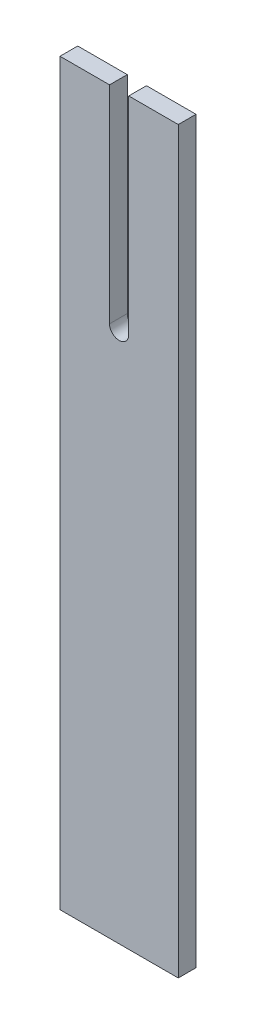
ISO-10303-21;
HEADER;
FILE_DESCRIPTION(('STEP AP214'),'2;1');
FILE_NAME('part.step','',(''),(''),'','','');
FILE_SCHEMA(('AUTOMOTIVE_DESIGN { 1 0 10303 214 1 1 1 1 }'));
ENDSEC;
DATA;
#1=APPLICATION_CONTEXT('core data for automotive mechanical design processes');
#2=APPLICATION_PROTOCOL_DEFINITION('international standard','automotive_design',2000,#1);
#3=PRODUCT_CONTEXT('',#1,'mechanical');
#4=PRODUCT('Part','Part','',(#3));
#5=PRODUCT_RELATED_PRODUCT_CATEGORY('part','',(#4));
#6=PRODUCT_DEFINITION_FORMATION('','',#4);
#7=PRODUCT_DEFINITION_CONTEXT('part definition',#1,'design');
#8=PRODUCT_DEFINITION('design','',#6,#7);
#9=PRODUCT_DEFINITION_SHAPE('','',#8);
#10=(LENGTH_UNIT() NAMED_UNIT(*) SI_UNIT(.MILLI.,.METRE.));
#11=(NAMED_UNIT(*) PLANE_ANGLE_UNIT() SI_UNIT($,.RADIAN.));
#12=(NAMED_UNIT(*) SI_UNIT($,.STERADIAN.) SOLID_ANGLE_UNIT());
#13=UNCERTAINTY_MEASURE_WITH_UNIT(LENGTH_MEASURE(1.E-05),#10,'distance_accuracy_value','');
#14=(GEOMETRIC_REPRESENTATION_CONTEXT(3) GLOBAL_UNCERTAINTY_ASSIGNED_CONTEXT((#13)) GLOBAL_UNIT_ASSIGNED_CONTEXT((#10,
#11,#12)) REPRESENTATION_CONTEXT('',''));
#15=CARTESIAN_POINT('',(0.,0.,0.));
#16=DIRECTION('',(0.,0.,1.));
#17=DIRECTION('',(1.,0.,0.));
#18=AXIS2_PLACEMENT_3D('',#15,#16,#17);
#19=CARTESIAN_POINT('',(-20.,125.,6.));
#20=DIRECTION('',(0.,-1.,0.));
#21=DIRECTION('',(0.,0.,-1.));
#22=AXIS2_PLACEMENT_3D('',#19,#20,#21);
#23=PLANE('',#22);
#24=DIRECTION('',(-1.,0.,0.));
#25=VECTOR('',#24,1.);
#26=CARTESIAN_POINT('',(-20.,125.,6.));
#27=LINE('',#26,#25);
#28=CARTESIAN_POINT('',(-3.25,125.,6.));
#29=VERTEX_POINT('',#28);
#30=CARTESIAN_POINT('',(-20.,125.,6.));
#31=VERTEX_POINT('',#30);
#32=EDGE_CURVE('E160',#29,#31,#27,.T.);
#33=ORIENTED_EDGE('',*,*,#32,.F.);
#34=DIRECTION('',(0.,0.,1.));
#35=VECTOR('',#34,1.);
#36=CARTESIAN_POINT('',(-3.25,125.,0.));
#37=LINE('',#36,#35);
#38=CARTESIAN_POINT('',(-3.25,125.,0.));
#39=VERTEX_POINT('',#38);
#40=EDGE_CURVE('E152',#39,#29,#37,.T.);
#41=ORIENTED_EDGE('',*,*,#40,.F.);
#42=DIRECTION('',(-1.,0.,0.));
#43=VECTOR('',#42,1.);
#44=CARTESIAN_POINT('',(-20.,125.,0.));
#45=LINE('',#44,#43);
#46=CARTESIAN_POINT('',(-20.,125.,0.));
#47=VERTEX_POINT('',#46);
#48=EDGE_CURVE('E172',#39,#47,#45,.T.);
#49=ORIENTED_EDGE('',*,*,#48,.T.);
#50=DIRECTION('',(0.,0.,-1.));
#51=VECTOR('',#50,1.);
#52=CARTESIAN_POINT('',(-20.,125.,6.));
#53=LINE('',#52,#51);
#54=EDGE_CURVE('E48',#31,#47,#53,.T.);
#55=ORIENTED_EDGE('',*,*,#54,.F.);
#56=EDGE_LOOP('',(#33,#41,#49,#55));
#57=FACE_BOUND('',#56,.T.);
#58=ADVANCED_FACE('F39',(#57),#23,.F.);
#59=CARTESIAN_POINT('',(20.,-125.,6.));
#60=DIRECTION('',(-1.,0.,0.));
#61=DIRECTION('',(0.,0.,1.));
#62=AXIS2_PLACEMENT_3D('',#59,#60,#61);
#63=PLANE('',#62);
#64=DIRECTION('',(0.,1.,0.));
#65=VECTOR('',#64,1.);
#66=CARTESIAN_POINT('',(20.,-125.,0.));
#67=LINE('',#66,#65);
#68=CARTESIAN_POINT('',(20.,-125.,0.));
#69=VERTEX_POINT('',#68);
#70=CARTESIAN_POINT('',(20.,125.,0.));
#71=VERTEX_POINT('',#70);
#72=EDGE_CURVE('E151',#69,#71,#67,.T.);
#73=ORIENTED_EDGE('',*,*,#72,.T.);
#74=DIRECTION('',(0.,0.,-1.));
#75=VECTOR('',#74,1.);
#76=CARTESIAN_POINT('',(20.,125.,6.));
#77=LINE('',#76,#75);
#78=CARTESIAN_POINT('',(20.,125.,6.));
#79=VERTEX_POINT('',#78);
#80=EDGE_CURVE('E11',#79,#71,#77,.T.);
#81=ORIENTED_EDGE('',*,*,#80,.F.);
#82=DIRECTION('',(0.,1.,0.));
#83=VECTOR('',#82,1.);
#84=CARTESIAN_POINT('',(20.,-125.,6.));
#85=LINE('',#84,#83);
#86=CARTESIAN_POINT('',(20.,-125.,6.));
#87=VERTEX_POINT('',#86);
#88=EDGE_CURVE('E157',#87,#79,#85,.T.);
#89=ORIENTED_EDGE('',*,*,#88,.F.);
#90=DIRECTION('',(0.,0.,-1.));
#91=VECTOR('',#90,1.);
#92=CARTESIAN_POINT('',(20.,-125.,6.));
#93=LINE('',#92,#91);
#94=EDGE_CURVE('E168',#87,#69,#93,.T.);
#95=ORIENTED_EDGE('',*,*,#94,.T.);
#96=EDGE_LOOP('',(#73,#81,#89,#95));
#97=FACE_BOUND('',#96,.T.);
#98=ADVANCED_FACE('F41',(#97),#63,.F.);
#99=CARTESIAN_POINT('',(3.25,125.,0.));
#100=VERTEX_POINT('',#99);
#101=EDGE_CURVE('E173',#71,#100,#45,.T.);
#102=ORIENTED_EDGE('',*,*,#101,.T.);
#103=DIRECTION('',(0.,0.,1.));
#104=VECTOR('',#103,1.);
#105=CARTESIAN_POINT('',(3.25,125.,0.));
#106=LINE('',#105,#104);
#107=CARTESIAN_POINT('',(3.25,125.,6.));
#108=VERTEX_POINT('',#107);
#109=EDGE_CURVE('E55',#100,#108,#106,.T.);
#110=ORIENTED_EDGE('',*,*,#109,.T.);
#111=EDGE_CURVE('E91',#79,#108,#27,.T.);
#112=ORIENTED_EDGE('',*,*,#111,.F.);
#113=ORIENTED_EDGE('',*,*,#80,.T.);
#114=EDGE_LOOP('',(#102,#110,#112,#113));
#115=FACE_BOUND('',#114,.T.);
#116=ADVANCED_FACE('F208',(#115),#23,.F.);
#117=CARTESIAN_POINT('',(-20.,-125.,6.));
#118=DIRECTION('',(1.,0.,0.));
#119=DIRECTION('',(0.,0.,-1.));
#120=AXIS2_PLACEMENT_3D('',#117,#118,#119);
#121=PLANE('',#120);
#122=DIRECTION('',(0.,-1.,0.));
#123=VECTOR('',#122,1.);
#124=CARTESIAN_POINT('',(-20.,-125.,0.));
#125=LINE('',#124,#123);
#126=CARTESIAN_POINT('',(-20.,-125.,0.));
#127=VERTEX_POINT('',#126);
#128=EDGE_CURVE('E176',#47,#127,#125,.T.);
#129=ORIENTED_EDGE('',*,*,#128,.T.);
#130=DIRECTION('',(0.,0.,-1.));
#131=VECTOR('',#130,1.);
#132=CARTESIAN_POINT('',(-20.,-125.,6.));
#133=LINE('',#132,#131);
#134=CARTESIAN_POINT('',(-20.,-125.,6.));
#135=VERTEX_POINT('',#134);
#136=EDGE_CURVE('E183',#135,#127,#133,.T.);
#137=ORIENTED_EDGE('',*,*,#136,.F.);
#138=DIRECTION('',(0.,-1.,0.));
#139=VECTOR('',#138,1.);
#140=CARTESIAN_POINT('',(-20.,-125.,6.));
#141=LINE('',#140,#139);
#142=EDGE_CURVE('E163',#31,#135,#141,.T.);
#143=ORIENTED_EDGE('',*,*,#142,.F.);
#144=ORIENTED_EDGE('',*,*,#54,.T.);
#145=EDGE_LOOP('',(#129,#137,#143,#144));
#146=FACE_BOUND('',#145,.T.);
#147=ADVANCED_FACE('F191',(#146),#121,.F.);
#148=CARTESIAN_POINT('',(-20.,-125.,6.));
#149=DIRECTION('',(0.,1.,0.));
#150=DIRECTION('',(0.,0.,1.));
#151=AXIS2_PLACEMENT_3D('',#148,#149,#150);
#152=PLANE('',#151);
#153=DIRECTION('',(1.,0.,0.));
#154=VECTOR('',#153,1.);
#155=CARTESIAN_POINT('',(-20.,-125.,0.));
#156=LINE('',#155,#154);
#157=EDGE_CURVE('E85',#127,#69,#156,.T.);
#158=ORIENTED_EDGE('',*,*,#157,.T.);
#159=ORIENTED_EDGE('',*,*,#94,.F.);
#160=DIRECTION('',(1.,0.,0.));
#161=VECTOR('',#160,1.);
#162=CARTESIAN_POINT('',(-20.,-125.,6.));
#163=LINE('',#162,#161);
#164=EDGE_CURVE('E64',#135,#87,#163,.T.);
#165=ORIENTED_EDGE('',*,*,#164,.F.);
#166=ORIENTED_EDGE('',*,*,#136,.T.);
#167=EDGE_LOOP('',(#158,#159,#165,#166));
#168=FACE_BOUND('',#167,.T.);
#169=ADVANCED_FACE('F199',(#168),#152,.F.);
#170=CARTESIAN_POINT('',(0.,0.,6.));
#171=DIRECTION('',(0.,0.,-1.));
#172=DIRECTION('',(-1.,0.,0.));
#173=AXIS2_PLACEMENT_3D('',#170,#171,#172);
#174=PLANE('',#173);
#175=CARTESIAN_POINT('',(0.,55.,6.));
#176=DIRECTION('',(0.,0.,1.));
#177=DIRECTION('',(-1.,0.,0.));
#178=AXIS2_PLACEMENT_3D('',#175,#176,#177);
#179=CIRCLE('',#178,3.24999999999999);
#180=CARTESIAN_POINT('',(-3.24999999999999,55.,6.));
#181=VERTEX_POINT('',#180);
#182=CARTESIAN_POINT('',(3.24999999999999,55.,6.));
#183=VERTEX_POINT('',#182);
#184=EDGE_CURVE('E121',#181,#183,#179,.T.);
#185=ORIENTED_EDGE('',*,*,#184,.F.);
#186=DIRECTION('',(0.,-1.,0.));
#187=VECTOR('',#186,1.);
#188=CARTESIAN_POINT('',(-3.25,125.,6.));
#189=LINE('',#188,#187);
#190=EDGE_CURVE('E135',#29,#181,#189,.T.);
#191=ORIENTED_EDGE('',*,*,#190,.F.);
#192=ORIENTED_EDGE('',*,*,#32,.T.);
#193=ORIENTED_EDGE('',*,*,#142,.T.);
#194=ORIENTED_EDGE('',*,*,#164,.T.);
#195=ORIENTED_EDGE('',*,*,#88,.T.);
#196=ORIENTED_EDGE('',*,*,#111,.T.);
#197=DIRECTION('',(0.,1.,0.));
#198=VECTOR('',#197,1.);
#199=CARTESIAN_POINT('',(3.25,125.,6.));
#200=LINE('',#199,#198);
#201=EDGE_CURVE('E139',#183,#108,#200,.T.);
#202=ORIENTED_EDGE('',*,*,#201,.F.);
#203=EDGE_LOOP('',(#185,#191,#192,#193,#194,#195,#196,#202));
#204=FACE_BOUND('',#203,.T.);
#205=ADVANCED_FACE('F201',(#204),#174,.F.);
#206=CARTESIAN_POINT('',(0.,0.,0.));
#207=DIRECTION('',(0.,0.,-1.));
#208=DIRECTION('',(-1.,0.,0.));
#209=AXIS2_PLACEMENT_3D('',#206,#207,#208);
#210=PLANE('',#209);
#211=DIRECTION('',(0.,-1.,0.));
#212=VECTOR('',#211,1.);
#213=CARTESIAN_POINT('',(-3.25,125.,0.));
#214=LINE('',#213,#212);
#215=CARTESIAN_POINT('',(-3.24999999999999,55.,0.));
#216=VERTEX_POINT('',#215);
#217=EDGE_CURVE('E124',#39,#216,#214,.T.);
#218=ORIENTED_EDGE('',*,*,#217,.T.);
#219=CARTESIAN_POINT('',(0.,55.,0.));
#220=DIRECTION('',(0.,0.,1.));
#221=DIRECTION('',(-1.,0.,0.));
#222=AXIS2_PLACEMENT_3D('',#219,#220,#221);
#223=CIRCLE('',#222,3.24999999999999);
#224=CARTESIAN_POINT('',(3.24999999999999,55.,0.));
#225=VERTEX_POINT('',#224);
#226=EDGE_CURVE('E118',#216,#225,#223,.T.);
#227=ORIENTED_EDGE('',*,*,#226,.T.);
#228=DIRECTION('',(0.,1.,0.));
#229=VECTOR('',#228,1.);
#230=CARTESIAN_POINT('',(3.25,125.,0.));
#231=LINE('',#230,#229);
#232=EDGE_CURVE('E126',#225,#100,#231,.T.);
#233=ORIENTED_EDGE('',*,*,#232,.T.);
#234=ORIENTED_EDGE('',*,*,#101,.F.);
#235=ORIENTED_EDGE('',*,*,#72,.F.);
#236=ORIENTED_EDGE('',*,*,#157,.F.);
#237=ORIENTED_EDGE('',*,*,#128,.F.);
#238=ORIENTED_EDGE('',*,*,#48,.F.);
#239=EDGE_LOOP('',(#218,#227,#233,#234,#235,#236,#237,#238));
#240=FACE_BOUND('',#239,.T.);
#241=ADVANCED_FACE('F132',(#240),#210,.T.);
#242=CARTESIAN_POINT('',(0.,55.,0.));
#243=DIRECTION('',(0.,0.,1.));
#244=DIRECTION('',(1.,0.,0.));
#245=AXIS2_PLACEMENT_3D('',#242,#243,#244);
#246=CYLINDRICAL_SURFACE('',#245,3.24999999999999);
#247=ORIENTED_EDGE('',*,*,#184,.T.);
#248=DIRECTION('',(0.,0.,1.));
#249=VECTOR('',#248,1.);
#250=CARTESIAN_POINT('',(3.24999999999999,55.,0.));
#251=LINE('',#250,#249);
#252=EDGE_CURVE('E115',#225,#183,#251,.T.);
#253=ORIENTED_EDGE('',*,*,#252,.F.);
#254=ORIENTED_EDGE('',*,*,#226,.F.);
#255=DIRECTION('',(0.,0.,1.));
#256=VECTOR('',#255,1.);
#257=CARTESIAN_POINT('',(-3.24999999999999,55.,0.));
#258=LINE('',#257,#256);
#259=EDGE_CURVE('E148',#216,#181,#258,.T.);
#260=ORIENTED_EDGE('',*,*,#259,.T.);
#261=EDGE_LOOP('',(#247,#253,#254,#260));
#262=FACE_BOUND('',#261,.T.);
#263=ADVANCED_FACE('F116',(#262),#246,.F.);
#264=CARTESIAN_POINT('',(-3.25,125.,0.));
#265=DIRECTION('',(-1.,0.,0.));
#266=DIRECTION('',(0.,-1.,0.));
#267=AXIS2_PLACEMENT_3D('',#264,#265,#266);
#268=PLANE('',#267);
#269=ORIENTED_EDGE('',*,*,#190,.T.);
#270=ORIENTED_EDGE('',*,*,#259,.F.);
#271=ORIENTED_EDGE('',*,*,#217,.F.);
#272=ORIENTED_EDGE('',*,*,#40,.T.);
#273=EDGE_LOOP('',(#269,#270,#271,#272));
#274=FACE_BOUND('',#273,.T.);
#275=ADVANCED_FACE('F223',(#274),#268,.F.);
#276=CARTESIAN_POINT('',(3.25,125.,0.));
#277=DIRECTION('',(1.,0.,0.));
#278=DIRECTION('',(0.,1.,0.));
#279=AXIS2_PLACEMENT_3D('',#276,#277,#278);
#280=PLANE('',#279);
#281=ORIENTED_EDGE('',*,*,#201,.T.);
#282=ORIENTED_EDGE('',*,*,#109,.F.);
#283=ORIENTED_EDGE('',*,*,#232,.F.);
#284=ORIENTED_EDGE('',*,*,#252,.T.);
#285=EDGE_LOOP('',(#281,#282,#283,#284));
#286=FACE_BOUND('',#285,.T.);
#287=ADVANCED_FACE('F127',(#286),#280,.F.);
#288=CLOSED_SHELL('',(#58,#98,#116,#147,#169,#205,#241,#263,#275,#287));
#289=MANIFOLD_SOLID_BREP('B2',#288);
#290=ADVANCED_BREP_SHAPE_REPRESENTATION('',(#18,#289),#14);
#291=SHAPE_DEFINITION_REPRESENTATION(#9,#290);
ENDSEC;
END-ISO-10303-21;
